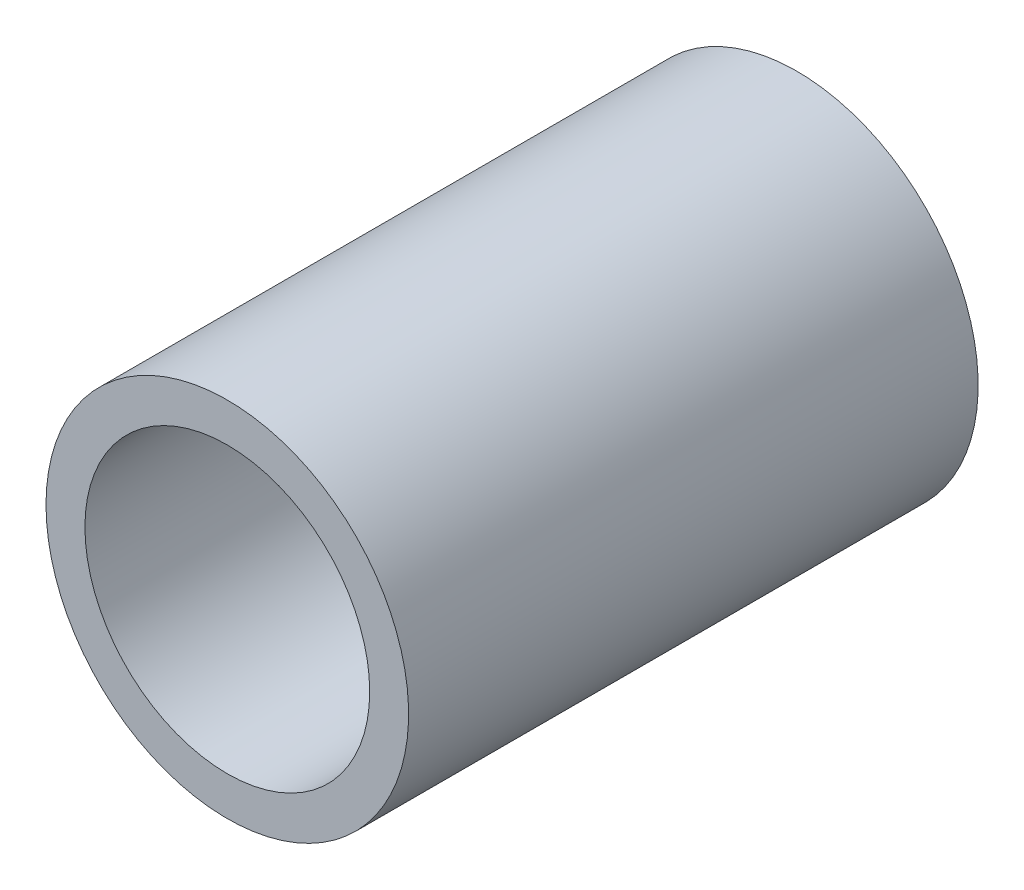
ISO-10303-21;
HEADER;
FILE_DESCRIPTION(('STEP AP214'),'2;1');
FILE_NAME('part.step','',(''),(''),'','','');
FILE_SCHEMA(('AUTOMOTIVE_DESIGN { 1 0 10303 214 1 1 1 1 }'));
ENDSEC;
DATA;
#1=APPLICATION_CONTEXT('core data for automotive mechanical design processes');
#2=APPLICATION_PROTOCOL_DEFINITION('international standard','automotive_design',2000,#1);
#3=PRODUCT_CONTEXT('',#1,'mechanical');
#4=PRODUCT('Part','Part','',(#3));
#5=PRODUCT_RELATED_PRODUCT_CATEGORY('part','',(#4));
#6=PRODUCT_DEFINITION_FORMATION('','',#4);
#7=PRODUCT_DEFINITION_CONTEXT('part definition',#1,'design');
#8=PRODUCT_DEFINITION('design','',#6,#7);
#9=PRODUCT_DEFINITION_SHAPE('','',#8);
#10=(LENGTH_UNIT() NAMED_UNIT(*) SI_UNIT(.MILLI.,.METRE.));
#11=(NAMED_UNIT(*) PLANE_ANGLE_UNIT() SI_UNIT($,.RADIAN.));
#12=(NAMED_UNIT(*) SI_UNIT($,.STERADIAN.) SOLID_ANGLE_UNIT());
#13=UNCERTAINTY_MEASURE_WITH_UNIT(LENGTH_MEASURE(1.E-05),#10,'distance_accuracy_value','');
#14=(GEOMETRIC_REPRESENTATION_CONTEXT(3) GLOBAL_UNCERTAINTY_ASSIGNED_CONTEXT((#13)) GLOBAL_UNIT_ASSIGNED_CONTEXT((#10,
#11,#12)) REPRESENTATION_CONTEXT('',''));
#15=CARTESIAN_POINT('',(0.,0.,0.));
#16=DIRECTION('',(0.,0.,1.));
#17=DIRECTION('',(1.,0.,0.));
#18=AXIS2_PLACEMENT_3D('',#15,#16,#17);
#19=CARTESIAN_POINT('',(0.,0.,76.2));
#20=DIRECTION('',(0.,0.,1.));
#21=DIRECTION('',(1.,0.,0.));
#22=AXIS2_PLACEMENT_3D('',#19,#20,#21);
#23=PLANE('',#22);
#24=CARTESIAN_POINT('',(0.,0.,76.2));
#25=DIRECTION('',(0.,0.,1.));
#26=DIRECTION('',(1.,0.,0.));
#27=AXIS2_PLACEMENT_3D('',#24,#25,#26);
#28=CIRCLE('',#27,24.257);
#29=CARTESIAN_POINT('',(-24.257,0.,76.2));
#30=VERTEX_POINT('',#29);
#31=EDGE_CURVE('E10',#30,#30,#28,.T.);
#32=ORIENTED_EDGE('',*,*,#31,.T.);
#33=EDGE_LOOP('',(#32));
#34=FACE_BOUND('',#33,.T.);
#35=CARTESIAN_POINT('',(0.,0.,76.2));
#36=DIRECTION('',(0.,0.,1.));
#37=DIRECTION('',(1.,0.,0.));
#38=AXIS2_PLACEMENT_3D('',#35,#36,#37);
#39=CIRCLE('',#38,19.05);
#40=CARTESIAN_POINT('',(-19.05,0.,76.2));
#41=VERTEX_POINT('',#40);
#42=EDGE_CURVE('E44',#41,#41,#39,.T.);
#43=ORIENTED_EDGE('',*,*,#42,.F.);
#44=EDGE_LOOP('',(#43));
#45=FACE_BOUND('',#44,.T.);
#46=ADVANCED_FACE('F33',(#34,#45),#23,.T.);
#47=CARTESIAN_POINT('',(0.,0.,0.));
#48=DIRECTION('',(0.,0.,1.));
#49=DIRECTION('',(1.,0.,0.));
#50=AXIS2_PLACEMENT_3D('',#47,#48,#49);
#51=PLANE('',#50);
#52=CARTESIAN_POINT('',(0.,0.,0.));
#53=DIRECTION('',(0.,0.,1.));
#54=DIRECTION('',(1.,0.,0.));
#55=AXIS2_PLACEMENT_3D('',#52,#53,#54);
#56=CIRCLE('',#55,24.257);
#57=CARTESIAN_POINT('',(-24.257,0.,0.));
#58=VERTEX_POINT('',#57);
#59=EDGE_CURVE('E37',#58,#58,#56,.T.);
#60=ORIENTED_EDGE('',*,*,#59,.F.);
#61=EDGE_LOOP('',(#60));
#62=FACE_BOUND('',#61,.T.);
#63=CARTESIAN_POINT('',(0.,0.,0.));
#64=DIRECTION('',(0.,0.,1.));
#65=DIRECTION('',(1.,0.,0.));
#66=AXIS2_PLACEMENT_3D('',#63,#64,#65);
#67=CIRCLE('',#66,19.05);
#68=CARTESIAN_POINT('',(-19.05,0.,0.));
#69=VERTEX_POINT('',#68);
#70=EDGE_CURVE('E46',#69,#69,#67,.T.);
#71=ORIENTED_EDGE('',*,*,#70,.T.);
#72=EDGE_LOOP('',(#71));
#73=FACE_BOUND('',#72,.T.);
#74=ADVANCED_FACE('F56',(#62,#73),#51,.F.);
#75=CARTESIAN_POINT('',(0.,0.,76.2));
#76=DIRECTION('',(0.,0.,-1.));
#77=DIRECTION('',(-1.,0.,0.));
#78=AXIS2_PLACEMENT_3D('',#75,#76,#77);
#79=CYLINDRICAL_SURFACE('',#78,24.257);
#80=CARTESIAN_POINT('',(-24.257,0.,76.2));
#81=CARTESIAN_POINT('',(-24.257,0.,75.40625));
#82=CARTESIAN_POINT('',(-24.257,0.,74.6125));
#83=CARTESIAN_POINT('',(-24.257,0.,73.025));
#84=CARTESIAN_POINT('',(-24.257,0.,72.23125));
#85=CARTESIAN_POINT('',(-24.257,0.,70.64375));
#86=CARTESIAN_POINT('',(-24.257,0.,69.85));
#87=CARTESIAN_POINT('',(-24.257,0.,68.2625));
#88=CARTESIAN_POINT('',(-24.257,0.,67.46875));
#89=CARTESIAN_POINT('',(-24.257,0.,65.88125));
#90=CARTESIAN_POINT('',(-24.257,0.,65.0875));
#91=CARTESIAN_POINT('',(-24.257,0.,63.5));
#92=CARTESIAN_POINT('',(-24.257,0.,62.70625));
#93=CARTESIAN_POINT('',(-24.257,0.,61.11875));
#94=CARTESIAN_POINT('',(-24.257,0.,60.325));
#95=CARTESIAN_POINT('',(-24.257,0.,58.7375));
#96=CARTESIAN_POINT('',(-24.257,0.,57.94375));
#97=CARTESIAN_POINT('',(-24.257,0.,56.35625));
#98=CARTESIAN_POINT('',(-24.257,0.,55.5625));
#99=CARTESIAN_POINT('',(-24.257,0.,53.975));
#100=CARTESIAN_POINT('',(-24.257,0.,53.18125));
#101=CARTESIAN_POINT('',(-24.257,0.,51.59375));
#102=CARTESIAN_POINT('',(-24.257,0.,50.8));
#103=CARTESIAN_POINT('',(-24.257,0.,49.2125));
#104=CARTESIAN_POINT('',(-24.257,0.,48.41875));
#105=CARTESIAN_POINT('',(-24.257,0.,46.83125));
#106=CARTESIAN_POINT('',(-24.257,0.,46.0375));
#107=CARTESIAN_POINT('',(-24.257,0.,44.45));
#108=CARTESIAN_POINT('',(-24.257,0.,43.65625));
#109=CARTESIAN_POINT('',(-24.257,0.,42.06875));
#110=CARTESIAN_POINT('',(-24.257,0.,41.275));
#111=CARTESIAN_POINT('',(-24.257,0.,39.6875));
#112=CARTESIAN_POINT('',(-24.257,0.,38.89375));
#113=CARTESIAN_POINT('',(-24.257,0.,37.30625));
#114=CARTESIAN_POINT('',(-24.257,0.,36.5125));
#115=CARTESIAN_POINT('',(-24.257,0.,34.925));
#116=CARTESIAN_POINT('',(-24.257,0.,34.13125));
#117=CARTESIAN_POINT('',(-24.257,0.,32.54375));
#118=CARTESIAN_POINT('',(-24.257,0.,31.75));
#119=CARTESIAN_POINT('',(-24.257,0.,30.1625));
#120=CARTESIAN_POINT('',(-24.257,0.,29.36875));
#121=CARTESIAN_POINT('',(-24.257,0.,27.78125));
#122=CARTESIAN_POINT('',(-24.257,0.,26.9875));
#123=CARTESIAN_POINT('',(-24.257,0.,25.4));
#124=CARTESIAN_POINT('',(-24.257,0.,24.60625));
#125=CARTESIAN_POINT('',(-24.257,0.,23.01875));
#126=CARTESIAN_POINT('',(-24.257,0.,22.225));
#127=CARTESIAN_POINT('',(-24.257,0.,20.6375));
#128=CARTESIAN_POINT('',(-24.257,0.,19.84375));
#129=CARTESIAN_POINT('',(-24.257,0.,18.25625));
#130=CARTESIAN_POINT('',(-24.257,0.,17.4625));
#131=CARTESIAN_POINT('',(-24.257,0.,15.875));
#132=CARTESIAN_POINT('',(-24.257,0.,15.08125));
#133=CARTESIAN_POINT('',(-24.257,0.,13.49375));
#134=CARTESIAN_POINT('',(-24.257,0.,12.7));
#135=CARTESIAN_POINT('',(-24.257,0.,11.1125));
#136=CARTESIAN_POINT('',(-24.257,0.,10.31875));
#137=CARTESIAN_POINT('',(-24.257,0.,8.73125));
#138=CARTESIAN_POINT('',(-24.257,0.,7.93750000000001));
#139=CARTESIAN_POINT('',(-24.257,0.,6.35));
#140=CARTESIAN_POINT('',(-24.257,0.,5.55625));
#141=CARTESIAN_POINT('',(-24.257,0.,3.96875));
#142=CARTESIAN_POINT('',(-24.257,0.,3.175));
#143=CARTESIAN_POINT('',(-24.257,0.,1.5875));
#144=CARTESIAN_POINT('',(-24.257,0.,0.793750000000001));
#145=CARTESIAN_POINT('',(-24.257,0.,0.));
#146=B_SPLINE_CURVE_WITH_KNOTS('',3,(#80,#81,#82,#83,#84,#85,#86,#87,#88,#89,#90,#91,#92,#93,
#94,#95,#96,#97,#98,#99,#100,#101,#102,#103,#104,#105,#106,#107,#108,#109,#110,#111,#112,#113,
#114,#115,#116,#117,#118,#119,#120,#121,#122,#123,#124,#125,#126,#127,#128,#129,#130,#131,#132,
#133,#134,#135,#136,#137,#138,#139,#140,#141,#142,#143,#144,#145),.UNSPECIFIED.,.F.,.F.,(4,2,2,
2,2,2,2,2,2,2,2,2,2,2,2,2,2,2,2,2,2,2,2,2,2,2,2,2,2,2,2,2,4),(0.,2.38125,4.7625,7.14375,
9.52500000000001,11.90625,14.2875,16.66875,19.05,21.43125,23.8125,26.19375,28.575,30.95625,
33.3375,35.71875,38.1,40.48125,42.8625,45.24375,47.625,50.00625,52.3875,54.76875,57.15,59.53125,
61.9125,64.29375,66.675,69.05625,71.4375,73.81875,76.2),.UNSPECIFIED.);
#147=EDGE_CURVE('BSEAM35',#30,#58,#146,.T.);
#148=ORIENTED_EDGE('',*,*,#31,.F.);
#149=ORIENTED_EDGE('',*,*,#59,.T.);
#150=ORIENTED_EDGE('',*,*,#147,.T.);
#151=ORIENTED_EDGE('',*,*,#147,.F.);
#152=EDGE_LOOP('',(#148,#150,#149,#151));
#153=FACE_BOUND('',#152,.T.);
#154=ADVANCED_FACE('F35',(#153),#79,.T.);
#155=CARTESIAN_POINT('',(0.,0.,76.2));
#156=DIRECTION('',(0.,0.,-1.));
#157=DIRECTION('',(-1.,0.,0.));
#158=AXIS2_PLACEMENT_3D('',#155,#156,#157);
#159=CYLINDRICAL_SURFACE('',#158,19.05);
#160=CARTESIAN_POINT('',(-19.05,0.,76.2));
#161=CARTESIAN_POINT('',(-19.05,0.,75.40625));
#162=CARTESIAN_POINT('',(-19.05,0.,74.6125));
#163=CARTESIAN_POINT('',(-19.05,0.,73.025));
#164=CARTESIAN_POINT('',(-19.05,0.,72.23125));
#165=CARTESIAN_POINT('',(-19.05,0.,70.64375));
#166=CARTESIAN_POINT('',(-19.05,0.,69.85));
#167=CARTESIAN_POINT('',(-19.05,0.,68.2625));
#168=CARTESIAN_POINT('',(-19.05,0.,67.46875));
#169=CARTESIAN_POINT('',(-19.05,0.,65.88125));
#170=CARTESIAN_POINT('',(-19.05,0.,65.0875));
#171=CARTESIAN_POINT('',(-19.05,0.,63.5));
#172=CARTESIAN_POINT('',(-19.05,0.,62.70625));
#173=CARTESIAN_POINT('',(-19.05,0.,61.11875));
#174=CARTESIAN_POINT('',(-19.05,0.,60.325));
#175=CARTESIAN_POINT('',(-19.05,0.,58.7375));
#176=CARTESIAN_POINT('',(-19.05,0.,57.94375));
#177=CARTESIAN_POINT('',(-19.05,0.,56.35625));
#178=CARTESIAN_POINT('',(-19.05,0.,55.5625));
#179=CARTESIAN_POINT('',(-19.05,0.,53.975));
#180=CARTESIAN_POINT('',(-19.05,0.,53.18125));
#181=CARTESIAN_POINT('',(-19.05,0.,51.59375));
#182=CARTESIAN_POINT('',(-19.05,0.,50.8));
#183=CARTESIAN_POINT('',(-19.05,0.,49.2125));
#184=CARTESIAN_POINT('',(-19.05,0.,48.41875));
#185=CARTESIAN_POINT('',(-19.05,0.,46.83125));
#186=CARTESIAN_POINT('',(-19.05,0.,46.0375));
#187=CARTESIAN_POINT('',(-19.05,0.,44.45));
#188=CARTESIAN_POINT('',(-19.05,0.,43.65625));
#189=CARTESIAN_POINT('',(-19.05,0.,42.06875));
#190=CARTESIAN_POINT('',(-19.05,0.,41.275));
#191=CARTESIAN_POINT('',(-19.05,0.,39.6875));
#192=CARTESIAN_POINT('',(-19.05,0.,38.89375));
#193=CARTESIAN_POINT('',(-19.05,0.,37.30625));
#194=CARTESIAN_POINT('',(-19.05,0.,36.5125));
#195=CARTESIAN_POINT('',(-19.05,0.,34.925));
#196=CARTESIAN_POINT('',(-19.05,0.,34.13125));
#197=CARTESIAN_POINT('',(-19.05,0.,32.54375));
#198=CARTESIAN_POINT('',(-19.05,0.,31.75));
#199=CARTESIAN_POINT('',(-19.05,0.,30.1625));
#200=CARTESIAN_POINT('',(-19.05,0.,29.36875));
#201=CARTESIAN_POINT('',(-19.05,0.,27.78125));
#202=CARTESIAN_POINT('',(-19.05,0.,26.9875));
#203=CARTESIAN_POINT('',(-19.05,0.,25.4));
#204=CARTESIAN_POINT('',(-19.05,0.,24.60625));
#205=CARTESIAN_POINT('',(-19.05,0.,23.01875));
#206=CARTESIAN_POINT('',(-19.05,0.,22.225));
#207=CARTESIAN_POINT('',(-19.05,0.,20.6375));
#208=CARTESIAN_POINT('',(-19.05,0.,19.84375));
#209=CARTESIAN_POINT('',(-19.05,0.,18.25625));
#210=CARTESIAN_POINT('',(-19.05,0.,17.4625));
#211=CARTESIAN_POINT('',(-19.05,0.,15.875));
#212=CARTESIAN_POINT('',(-19.05,0.,15.08125));
#213=CARTESIAN_POINT('',(-19.05,0.,13.49375));
#214=CARTESIAN_POINT('',(-19.05,0.,12.7));
#215=CARTESIAN_POINT('',(-19.05,0.,11.1125));
#216=CARTESIAN_POINT('',(-19.05,0.,10.31875));
#217=CARTESIAN_POINT('',(-19.05,0.,8.73125));
#218=CARTESIAN_POINT('',(-19.05,0.,7.93750000000001));
#219=CARTESIAN_POINT('',(-19.05,0.,6.35));
#220=CARTESIAN_POINT('',(-19.05,0.,5.55625));
#221=CARTESIAN_POINT('',(-19.05,0.,3.96875));
#222=CARTESIAN_POINT('',(-19.05,0.,3.175));
#223=CARTESIAN_POINT('',(-19.05,0.,1.5875));
#224=CARTESIAN_POINT('',(-19.05,0.,0.793750000000001));
#225=CARTESIAN_POINT('',(-19.05,0.,0.));
#226=B_SPLINE_CURVE_WITH_KNOTS('',3,(#160,#161,#162,#163,#164,#165,#166,#167,#168,#169,#170,
#171,#172,#173,#174,#175,#176,#177,#178,#179,#180,#181,#182,#183,#184,#185,#186,#187,#188,#189,
#190,#191,#192,#193,#194,#195,#196,#197,#198,#199,#200,#201,#202,#203,#204,#205,#206,#207,#208,
#209,#210,#211,#212,#213,#214,#215,#216,#217,#218,#219,#220,#221,#222,#223,#224,#225),
.UNSPECIFIED.,.F.,.F.,(4,2,2,2,2,2,2,2,2,2,2,2,2,2,2,2,2,2,2,2,2,2,2,2,2,2,2,2,2,2,2,2,4),(0.,
2.38125,4.7625,7.14375,9.52500000000001,11.90625,14.2875,16.66875,19.05,21.43125,23.8125,
26.19375,28.575,30.95625,33.3375,35.71875,38.1,40.48125,42.8625,45.24375,47.625,50.00625,
52.3875,54.76875,57.15,59.53125,61.9125,64.29375,66.675,69.05625,71.4375,73.81875,76.2),.UNSPECIFIED.);
#227=EDGE_CURVE('BSEAM52',#41,#69,#226,.T.);
#228=ORIENTED_EDGE('',*,*,#42,.T.);
#229=ORIENTED_EDGE('',*,*,#70,.F.);
#230=ORIENTED_EDGE('',*,*,#227,.T.);
#231=ORIENTED_EDGE('',*,*,#227,.F.);
#232=EDGE_LOOP('',(#228,#230,#229,#231));
#233=FACE_BOUND('',#232,.T.);
#234=ADVANCED_FACE('F52',(#233),#159,.F.);
#235=CLOSED_SHELL('',(#46,#74,#154,#234));
#236=MANIFOLD_SOLID_BREP('B2',#235);
#237=ADVANCED_BREP_SHAPE_REPRESENTATION('',(#18,#236),#14);
#238=SHAPE_DEFINITION_REPRESENTATION(#9,#237);
ENDSEC;
END-ISO-10303-21;
